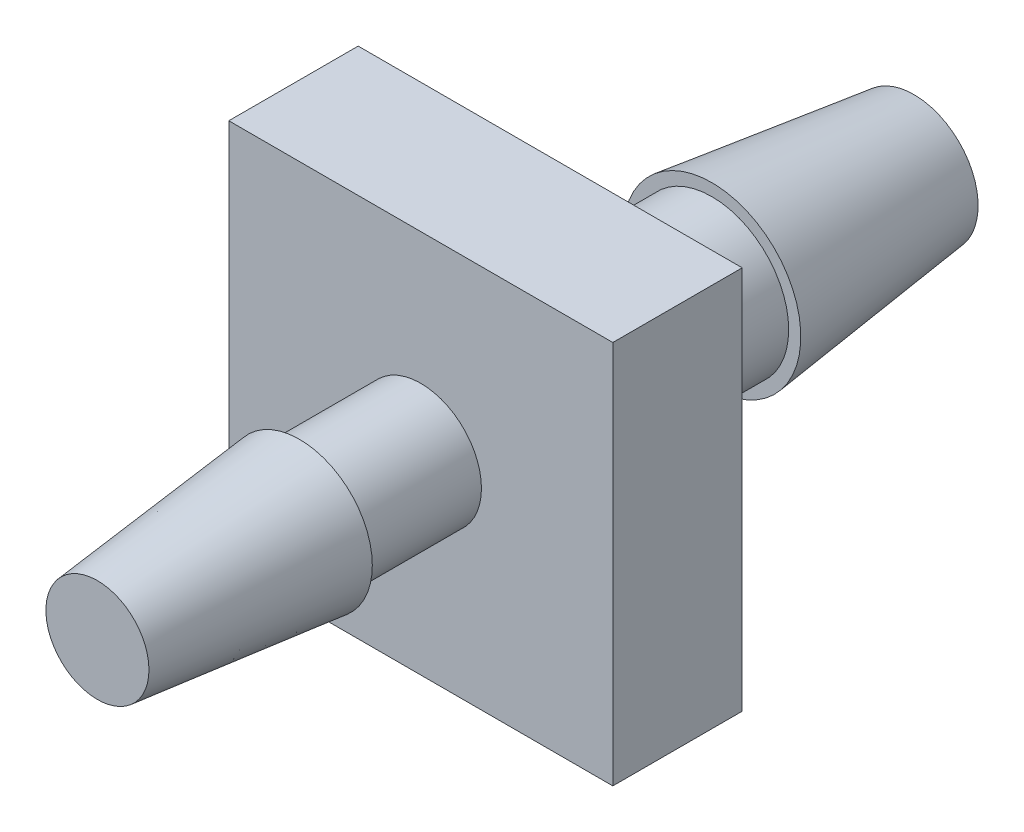
ISO-10303-21;
HEADER;
FILE_DESCRIPTION(('STEP AP214'),'2;1');
FILE_NAME('part.step','',(''),(''),'','','');
FILE_SCHEMA(('AUTOMOTIVE_DESIGN { 1 0 10303 214 1 1 1 1 }'));
ENDSEC;
DATA;
#1=APPLICATION_CONTEXT('core data for automotive mechanical design processes');
#2=APPLICATION_PROTOCOL_DEFINITION('international standard','automotive_design',2000,#1);
#3=PRODUCT_CONTEXT('',#1,'mechanical');
#4=PRODUCT('Part','Part','',(#3));
#5=PRODUCT_RELATED_PRODUCT_CATEGORY('part','',(#4));
#6=PRODUCT_DEFINITION_FORMATION('','',#4);
#7=PRODUCT_DEFINITION_CONTEXT('part definition',#1,'design');
#8=PRODUCT_DEFINITION('design','',#6,#7);
#9=PRODUCT_DEFINITION_SHAPE('','',#8);
#10=(LENGTH_UNIT() NAMED_UNIT(*) SI_UNIT(.MILLI.,.METRE.));
#11=(NAMED_UNIT(*) PLANE_ANGLE_UNIT() SI_UNIT($,.RADIAN.));
#12=(NAMED_UNIT(*) SI_UNIT($,.STERADIAN.) SOLID_ANGLE_UNIT());
#13=UNCERTAINTY_MEASURE_WITH_UNIT(LENGTH_MEASURE(1.E-05),#10,'distance_accuracy_value','');
#14=(GEOMETRIC_REPRESENTATION_CONTEXT(3) GLOBAL_UNCERTAINTY_ASSIGNED_CONTEXT((#13)) GLOBAL_UNIT_ASSIGNED_CONTEXT((#10,
#11,#12)) REPRESENTATION_CONTEXT('',''));
#15=CARTESIAN_POINT('',(0.,0.,0.));
#16=DIRECTION('',(0.,0.,1.));
#17=DIRECTION('',(1.,0.,0.));
#18=AXIS2_PLACEMENT_3D('',#15,#16,#17);
#19=CARTESIAN_POINT('',(-7.20758725341425,-8.02663125948407,0.));
#20=DIRECTION('',(0.,0.,1.));
#21=DIRECTION('',(1.,0.,0.));
#22=AXIS2_PLACEMENT_3D('',#19,#20,#21);
#23=PLANE('',#22);
#24=DIRECTION('',(0.,-1.,0.));
#25=VECTOR('',#24,1.);
#26=CARTESIAN_POINT('',(-7.20758725341425,1.47336874051593,0.));
#27=LINE('',#26,#25);
#28=CARTESIAN_POINT('',(-7.20758725341425,1.47336874051593,0.));
#29=VERTEX_POINT('',#28);
#30=CARTESIAN_POINT('',(-7.20758725341425,-8.02663125948407,0.));
#31=VERTEX_POINT('',#30);
#32=EDGE_CURVE('E80',#29,#31,#27,.T.);
#33=ORIENTED_EDGE('',*,*,#32,.F.);
#34=DIRECTION('',(-1.,0.,0.));
#35=VECTOR('',#34,1.);
#36=CARTESIAN_POINT('',(-7.20758725341425,1.47336874051593,0.));
#37=LINE('',#36,#35);
#38=CARTESIAN_POINT('',(2.29241274658575,1.47336874051593,0.));
#39=VERTEX_POINT('',#38);
#40=EDGE_CURVE('E102',#39,#29,#37,.T.);
#41=ORIENTED_EDGE('',*,*,#40,.F.);
#42=DIRECTION('',(0.,1.,0.));
#43=VECTOR('',#42,1.);
#44=CARTESIAN_POINT('',(2.29241274658575,1.47336874051593,0.));
#45=LINE('',#44,#43);
#46=CARTESIAN_POINT('',(2.29241274658575,-8.02663125948407,0.));
#47=VERTEX_POINT('',#46);
#48=EDGE_CURVE('E81',#47,#39,#45,.T.);
#49=ORIENTED_EDGE('',*,*,#48,.F.);
#50=DIRECTION('',(1.,0.,0.));
#51=VECTOR('',#50,1.);
#52=CARTESIAN_POINT('',(-7.20758725341425,-8.02663125948407,0.));
#53=LINE('',#52,#51);
#54=EDGE_CURVE('E75',#31,#47,#53,.T.);
#55=ORIENTED_EDGE('',*,*,#54,.F.);
#56=EDGE_LOOP('',(#33,#41,#49,#55));
#57=FACE_BOUND('',#56,.T.);
#58=CARTESIAN_POINT('',(-2.45758725341425,-3.27663125948407,0.));
#59=DIRECTION('',(0.,0.,1.));
#60=DIRECTION('',(1.,0.,0.));
#61=AXIS2_PLACEMENT_3D('',#58,#59,#60);
#62=CIRCLE('',#61,1.9);
#63=CARTESIAN_POINT('',(-0.557587253414249,-3.27663125948407,0.));
#64=VERTEX_POINT('',#63);
#65=EDGE_CURVE('E11',#64,#64,#62,.F.);
#66=ORIENTED_EDGE('',*,*,#65,.F.);
#67=EDGE_LOOP('',(#66));
#68=FACE_BOUND('',#67,.T.);
#69=ADVANCED_FACE('F34',(#57,#68),#23,.F.);
#70=CARTESIAN_POINT('',(-7.20758725341425,-8.02663125948407,3.2));
#71=DIRECTION('',(0.,0.,1.));
#72=DIRECTION('',(1.,0.,0.));
#73=AXIS2_PLACEMENT_3D('',#70,#71,#72);
#74=PLANE('',#73);
#75=DIRECTION('',(0.,-1.,0.));
#76=VECTOR('',#75,1.);
#77=CARTESIAN_POINT('',(-7.20758725341425,1.47336874051593,3.2));
#78=LINE('',#77,#76);
#79=CARTESIAN_POINT('',(-7.20758725341425,1.47336874051593,3.2));
#80=VERTEX_POINT('',#79);
#81=CARTESIAN_POINT('',(-7.20758725341425,-8.02663125948407,3.2));
#82=VERTEX_POINT('',#81);
#83=EDGE_CURVE('E104',#80,#82,#78,.T.);
#84=ORIENTED_EDGE('',*,*,#83,.T.);
#85=DIRECTION('',(1.,0.,0.));
#86=VECTOR('',#85,1.);
#87=CARTESIAN_POINT('',(-7.20758725341425,-8.02663125948407,3.2));
#88=LINE('',#87,#86);
#89=CARTESIAN_POINT('',(2.29241274658575,-8.02663125948407,3.2));
#90=VERTEX_POINT('',#89);
#91=EDGE_CURVE('E88',#82,#90,#88,.T.);
#92=ORIENTED_EDGE('',*,*,#91,.T.);
#93=DIRECTION('',(0.,1.,0.));
#94=VECTOR('',#93,1.);
#95=CARTESIAN_POINT('',(2.29241274658575,1.47336874051593,3.2));
#96=LINE('',#95,#94);
#97=CARTESIAN_POINT('',(2.29241274658575,1.47336874051593,3.2));
#98=VERTEX_POINT('',#97);
#99=EDGE_CURVE('E54',#90,#98,#96,.T.);
#100=ORIENTED_EDGE('',*,*,#99,.T.);
#101=DIRECTION('',(-1.,0.,0.));
#102=VECTOR('',#101,1.);
#103=CARTESIAN_POINT('',(-7.20758725341425,1.47336874051593,3.2));
#104=LINE('',#103,#102);
#105=EDGE_CURVE('E49',#98,#80,#104,.T.);
#106=ORIENTED_EDGE('',*,*,#105,.T.);
#107=EDGE_LOOP('',(#84,#92,#100,#106));
#108=FACE_BOUND('',#107,.T.);
#109=CARTESIAN_POINT('',(-2.45758725341425,-3.27663125948407,3.2));
#110=DIRECTION('',(0.,0.,1.));
#111=DIRECTION('',(1.,0.,0.));
#112=AXIS2_PLACEMENT_3D('',#109,#110,#111);
#113=CIRCLE('',#112,1.5);
#114=CARTESIAN_POINT('',(-0.957587253414249,-3.27663125948407,3.2));
#115=VERTEX_POINT('',#114);
#116=EDGE_CURVE('E97',#115,#115,#113,.T.);
#117=ORIENTED_EDGE('',*,*,#116,.F.);
#118=EDGE_LOOP('',(#117));
#119=FACE_BOUND('',#118,.T.);
#120=ADVANCED_FACE('F117',(#108,#119),#74,.T.);
#121=CARTESIAN_POINT('',(-7.20758725341425,1.47336874051593,3.2));
#122=DIRECTION('',(1.,0.,0.));
#123=DIRECTION('',(0.,1.,0.));
#124=AXIS2_PLACEMENT_3D('',#121,#122,#123);
#125=PLANE('',#124);
#126=ORIENTED_EDGE('',*,*,#32,.T.);
#127=DIRECTION('',(0.,0.,-1.));
#128=VECTOR('',#127,1.);
#129=CARTESIAN_POINT('',(-7.20758725341425,-8.02663125948407,3.2));
#130=LINE('',#129,#128);
#131=EDGE_CURVE('E42',#82,#31,#130,.T.);
#132=ORIENTED_EDGE('',*,*,#131,.F.);
#133=ORIENTED_EDGE('',*,*,#83,.F.);
#134=DIRECTION('',(0.,0.,-1.));
#135=VECTOR('',#134,1.);
#136=CARTESIAN_POINT('',(-7.20758725341425,1.47336874051593,3.2));
#137=LINE('',#136,#135);
#138=EDGE_CURVE('E93',#80,#29,#137,.T.);
#139=ORIENTED_EDGE('',*,*,#138,.T.);
#140=EDGE_LOOP('',(#126,#132,#133,#139));
#141=FACE_BOUND('',#140,.T.);
#142=ADVANCED_FACE('F36',(#141),#125,.F.);
#143=CARTESIAN_POINT('',(-7.20758725341425,-8.02663125948407,3.2));
#144=DIRECTION('',(0.,1.,0.));
#145=DIRECTION('',(0.,0.,1.));
#146=AXIS2_PLACEMENT_3D('',#143,#144,#145);
#147=PLANE('',#146);
#148=ORIENTED_EDGE('',*,*,#54,.T.);
#149=DIRECTION('',(0.,0.,-1.));
#150=VECTOR('',#149,1.);
#151=CARTESIAN_POINT('',(2.29241274658575,-8.02663125948407,3.2));
#152=LINE('',#151,#150);
#153=EDGE_CURVE('E91',#90,#47,#152,.T.);
#154=ORIENTED_EDGE('',*,*,#153,.F.);
#155=ORIENTED_EDGE('',*,*,#91,.F.);
#156=ORIENTED_EDGE('',*,*,#131,.T.);
#157=EDGE_LOOP('',(#148,#154,#155,#156));
#158=FACE_BOUND('',#157,.T.);
#159=ADVANCED_FACE('F87',(#158),#147,.F.);
#160=CARTESIAN_POINT('',(2.29241274658575,1.47336874051593,3.2));
#161=DIRECTION('',(-1.,0.,0.));
#162=DIRECTION('',(0.,-1.,0.));
#163=AXIS2_PLACEMENT_3D('',#160,#161,#162);
#164=PLANE('',#163);
#165=ORIENTED_EDGE('',*,*,#48,.T.);
#166=DIRECTION('',(0.,0.,-1.));
#167=VECTOR('',#166,1.);
#168=CARTESIAN_POINT('',(2.29241274658575,1.47336874051593,3.2));
#169=LINE('',#168,#167);
#170=EDGE_CURVE('E110',#98,#39,#169,.T.);
#171=ORIENTED_EDGE('',*,*,#170,.F.);
#172=ORIENTED_EDGE('',*,*,#99,.F.);
#173=ORIENTED_EDGE('',*,*,#153,.T.);
#174=EDGE_LOOP('',(#165,#171,#172,#173));
#175=FACE_BOUND('',#174,.T.);
#176=ADVANCED_FACE('F114',(#175),#164,.F.);
#177=CARTESIAN_POINT('',(-7.20758725341425,1.47336874051593,3.2));
#178=DIRECTION('',(0.,-1.,0.));
#179=DIRECTION('',(0.,0.,-1.));
#180=AXIS2_PLACEMENT_3D('',#177,#178,#179);
#181=PLANE('',#180);
#182=ORIENTED_EDGE('',*,*,#40,.T.);
#183=ORIENTED_EDGE('',*,*,#138,.F.);
#184=ORIENTED_EDGE('',*,*,#105,.F.);
#185=ORIENTED_EDGE('',*,*,#170,.T.);
#186=EDGE_LOOP('',(#182,#183,#184,#185));
#187=FACE_BOUND('',#186,.T.);
#188=ADVANCED_FACE('F116',(#187),#181,.F.);
#189=CARTESIAN_POINT('',(-2.45758725341425,-3.27663125948407,6.2));
#190=DIRECTION('',(0.,0.,-1.));
#191=DIRECTION('',(-1.,0.,0.));
#192=AXIS2_PLACEMENT_3D('',#189,#190,#191);
#193=CYLINDRICAL_SURFACE('',#192,1.5);
#194=CARTESIAN_POINT('',(-2.45758725341425,-3.27663125948407,6.2));
#195=DIRECTION('',(0.,0.,1.));
#196=DIRECTION('',(1.,0.,0.));
#197=AXIS2_PLACEMENT_3D('',#194,#195,#196);
#198=CIRCLE('',#197,1.5);
#199=CARTESIAN_POINT('',(-0.957587253414249,-3.27663125948407,6.2));
#200=VERTEX_POINT('',#199);
#201=EDGE_CURVE('E94',#200,#200,#198,.T.);
#202=ORIENTED_EDGE('',*,*,#201,.F.);
#203=EDGE_LOOP('',(#202));
#204=FACE_BOUND('',#203,.T.);
#205=ORIENTED_EDGE('',*,*,#116,.T.);
#206=EDGE_LOOP('',(#205));
#207=FACE_BOUND('',#206,.T.);
#208=ADVANCED_FACE('F160',(#204,#207),#193,.T.);
#209=CARTESIAN_POINT('',(-2.45758725341425,-3.27663125948407,6.2));
#210=DIRECTION('',(0.,0.,1.));
#211=DIRECTION('',(1.,0.,0.));
#212=AXIS2_PLACEMENT_3D('',#209,#210,#211);
#213=PLANE('',#212);
#214=CARTESIAN_POINT('',(-2.45758725341425,-3.27663125948407,6.2));
#215=DIRECTION('',(0.,0.,1.));
#216=DIRECTION('',(1.,0.,0.));
#217=AXIS2_PLACEMENT_3D('',#214,#215,#216);
#218=CIRCLE('',#217,1.8);
#219=CARTESIAN_POINT('',(-0.65758725341425,-3.27663125948407,6.2));
#220=VERTEX_POINT('',#219);
#221=EDGE_CURVE('E126',#220,#220,#218,.T.);
#222=ORIENTED_EDGE('',*,*,#221,.F.);
#223=EDGE_LOOP('',(#222));
#224=FACE_BOUND('',#223,.T.);
#225=ORIENTED_EDGE('',*,*,#201,.T.);
#226=EDGE_LOOP('',(#225));
#227=FACE_BOUND('',#226,.T.);
#228=ADVANCED_FACE('F189',(#224,#227),#213,.F.);
#229=CARTESIAN_POINT('',(-2.45758725341425,-3.27663125948407,6.2));
#230=DIRECTION('',(0.,0.,-1.));
#231=DIRECTION('',(1.,0.,0.));
#232=AXIS2_PLACEMENT_3D('',#229,#230,#231);
#233=CONICAL_SURFACE('',#232,1.8,0.10471975511966);
#234=CARTESIAN_POINT('',(-2.45758725341425,-3.27663125948407,11.2));
#235=DIRECTION('',(0.,0.,1.));
#236=DIRECTION('',(1.,0.,0.));
#237=AXIS2_PLACEMENT_3D('',#234,#235,#236);
#238=CIRCLE('',#237,1.27447882367162);
#239=CARTESIAN_POINT('',(-1.18310842974263,-3.27663125948407,11.2));
#240=VERTEX_POINT('',#239);
#241=EDGE_CURVE('E124',#240,#240,#238,.T.);
#242=ORIENTED_EDGE('',*,*,#241,.F.);
#243=EDGE_LOOP('',(#242));
#244=FACE_BOUND('',#243,.T.);
#245=ORIENTED_EDGE('',*,*,#221,.T.);
#246=EDGE_LOOP('',(#245));
#247=FACE_BOUND('',#246,.T.);
#248=ADVANCED_FACE('F198',(#244,#247),#233,.T.);
#249=CARTESIAN_POINT('',(-2.45758725341425,-3.27663125948407,11.2));
#250=DIRECTION('',(0.,0.,1.));
#251=DIRECTION('',(1.,0.,0.));
#252=AXIS2_PLACEMENT_3D('',#249,#250,#251);
#253=PLANE('',#252);
#254=ORIENTED_EDGE('',*,*,#241,.T.);
#255=EDGE_LOOP('',(#254));
#256=FACE_BOUND('',#255,.T.);
#257=ADVANCED_FACE('F152',(#256),#253,.T.);
#258=CARTESIAN_POINT('',(-2.45758725341425,-3.27663125948407,-4.));
#259=DIRECTION('',(0.,0.,1.));
#260=DIRECTION('',(1.,0.,0.));
#261=AXIS2_PLACEMENT_3D('',#258,#259,#260);
#262=CYLINDRICAL_SURFACE('',#261,1.9);
#263=CARTESIAN_POINT('',(-2.45758725341425,-3.27663125948407,-4.));
#264=DIRECTION('',(0.,0.,-1.));
#265=DIRECTION('',(-1.,0.,0.));
#266=AXIS2_PLACEMENT_3D('',#263,#264,#265);
#267=CIRCLE('',#266,1.9);
#268=CARTESIAN_POINT('',(-4.35758725341425,-3.27663125948407,-4.));
#269=VERTEX_POINT('',#268);
#270=EDGE_CURVE('E131',#269,#269,#267,.T.);
#271=ORIENTED_EDGE('',*,*,#270,.F.);
#272=EDGE_LOOP('',(#271));
#273=FACE_BOUND('',#272,.T.);
#274=ORIENTED_EDGE('',*,*,#65,.T.);
#275=EDGE_LOOP('',(#274));
#276=FACE_BOUND('',#275,.T.);
#277=ADVANCED_FACE('F146',(#273,#276),#262,.T.);
#278=CARTESIAN_POINT('',(-2.45758725341425,-3.27663125948407,-4.));
#279=DIRECTION('',(0.,0.,-1.));
#280=DIRECTION('',(-1.,0.,0.));
#281=AXIS2_PLACEMENT_3D('',#278,#279,#280);
#282=PLANE('',#281);
#283=CARTESIAN_POINT('',(-2.45758725341425,-3.27663125948407,-4.));
#284=DIRECTION('',(0.,0.,-1.));
#285=DIRECTION('',(-1.,0.,0.));
#286=AXIS2_PLACEMENT_3D('',#283,#284,#285);
#287=CIRCLE('',#286,2.2);
#288=CARTESIAN_POINT('',(-4.65758725341425,-3.27663125948407,-4.));
#289=VERTEX_POINT('',#288);
#290=EDGE_CURVE('E137',#289,#289,#287,.T.);
#291=ORIENTED_EDGE('',*,*,#290,.F.);
#292=EDGE_LOOP('',(#291));
#293=FACE_BOUND('',#292,.T.);
#294=ORIENTED_EDGE('',*,*,#270,.T.);
#295=EDGE_LOOP('',(#294));
#296=FACE_BOUND('',#295,.T.);
#297=ADVANCED_FACE('F143',(#293,#296),#282,.F.);
#298=CARTESIAN_POINT('',(-2.45758725341425,-3.27663125948407,-4.));
#299=DIRECTION('',(0.,0.,1.));
#300=DIRECTION('',(-1.,0.,0.));
#301=AXIS2_PLACEMENT_3D('',#298,#299,#300);
#302=CONICAL_SURFACE('',#301,2.2,0.122173047639603);
#303=CARTESIAN_POINT('',(-2.45758725341425,-3.27663125948407,-9.));
#304=DIRECTION('',(0.,0.,-1.));
#305=DIRECTION('',(-1.,0.,0.));
#306=AXIS2_PLACEMENT_3D('',#303,#304,#305);
#307=CIRCLE('',#306,1.58607719548547);
#308=CARTESIAN_POINT('',(-4.04366444889972,-3.27663125948407,-9.));
#309=VERTEX_POINT('',#308);
#310=EDGE_CURVE('E134',#309,#309,#307,.T.);
#311=ORIENTED_EDGE('',*,*,#310,.F.);
#312=EDGE_LOOP('',(#311));
#313=FACE_BOUND('',#312,.T.);
#314=ORIENTED_EDGE('',*,*,#290,.T.);
#315=EDGE_LOOP('',(#314));
#316=FACE_BOUND('',#315,.T.);
#317=ADVANCED_FACE('F141',(#313,#316),#302,.T.);
#318=CARTESIAN_POINT('',(-2.45758725341425,-3.27663125948407,-9.));
#319=DIRECTION('',(0.,0.,-1.));
#320=DIRECTION('',(-1.,0.,0.));
#321=AXIS2_PLACEMENT_3D('',#318,#319,#320);
#322=PLANE('',#321);
#323=ORIENTED_EDGE('',*,*,#310,.T.);
#324=EDGE_LOOP('',(#323));
#325=FACE_BOUND('',#324,.T.);
#326=ADVANCED_FACE('F241',(#325),#322,.T.);
#327=CLOSED_SHELL('',(#69,#120,#142,#159,#176,#188,#208,#228,#248,#257,#277,#297,#317,#326));
#328=MANIFOLD_SOLID_BREP('B2',#327);
#329=ADVANCED_BREP_SHAPE_REPRESENTATION('',(#18,#328),#14);
#330=SHAPE_DEFINITION_REPRESENTATION(#9,#329);
ENDSEC;
END-ISO-10303-21;
